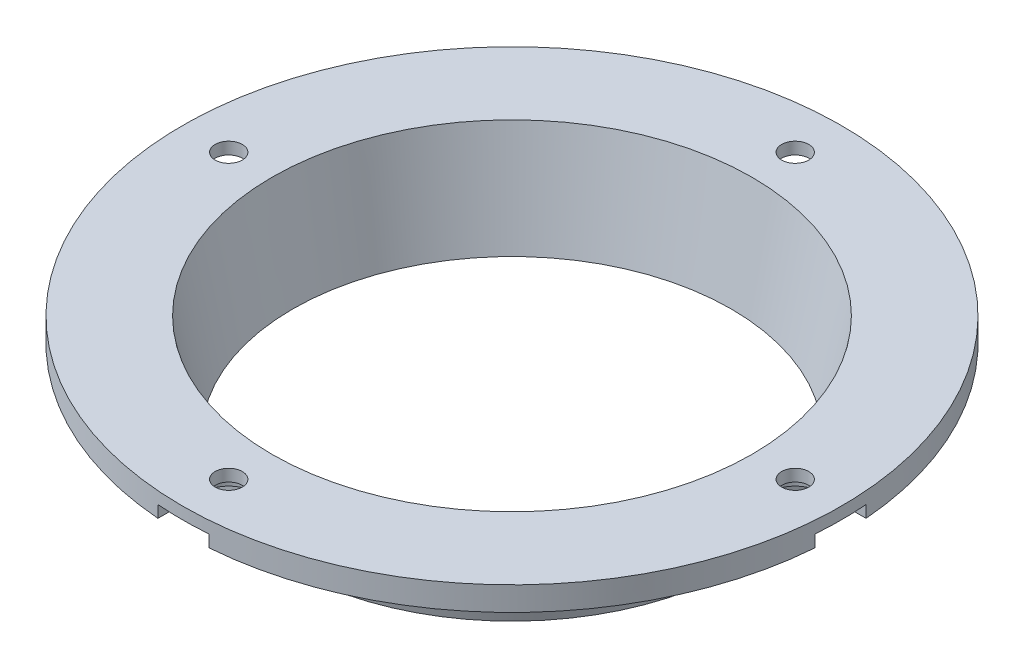
ISO-10303-21;
HEADER;
FILE_DESCRIPTION(('STEP AP214'),'2;1');
FILE_NAME('part.step','',(''),(''),'','','');
FILE_SCHEMA(('AUTOMOTIVE_DESIGN { 1 0 10303 214 1 1 1 1 }'));
ENDSEC;
DATA;
#1=APPLICATION_CONTEXT('core data for automotive mechanical design processes');
#2=APPLICATION_PROTOCOL_DEFINITION('international standard','automotive_design',2000,#1);
#3=PRODUCT_CONTEXT('',#1,'mechanical');
#4=PRODUCT('Part','Part','',(#3));
#5=PRODUCT_RELATED_PRODUCT_CATEGORY('part','',(#4));
#6=PRODUCT_DEFINITION_FORMATION('','',#4);
#7=PRODUCT_DEFINITION_CONTEXT('part definition',#1,'design');
#8=PRODUCT_DEFINITION('design','',#6,#7);
#9=PRODUCT_DEFINITION_SHAPE('','',#8);
#10=(LENGTH_UNIT() NAMED_UNIT(*) SI_UNIT(.MILLI.,.METRE.));
#11=(NAMED_UNIT(*) PLANE_ANGLE_UNIT() SI_UNIT($,.RADIAN.));
#12=(NAMED_UNIT(*) SI_UNIT($,.STERADIAN.) SOLID_ANGLE_UNIT());
#13=UNCERTAINTY_MEASURE_WITH_UNIT(LENGTH_MEASURE(1.E-05),#10,'distance_accuracy_value','');
#14=(GEOMETRIC_REPRESENTATION_CONTEXT(3) GLOBAL_UNCERTAINTY_ASSIGNED_CONTEXT((#13)) GLOBAL_UNIT_ASSIGNED_CONTEXT((#10,
#11,#12)) REPRESENTATION_CONTEXT('',''));
#15=CARTESIAN_POINT('',(0.,0.,0.));
#16=DIRECTION('',(0.,0.,1.));
#17=DIRECTION('',(1.,0.,0.));
#18=AXIS2_PLACEMENT_3D('',#15,#16,#17);
#19=CARTESIAN_POINT('',(-3.19999999999799,-8.,0.));
#20=DIRECTION('',(-1.,0.,0.));
#21=DIRECTION('',(0.,0.,1.));
#22=AXIS2_PLACEMENT_3D('',#19,#20,#21);
#23=PLANE('',#22);
#24=DIRECTION('',(0.,0.,-1.));
#25=VECTOR('',#24,1.);
#26=CARTESIAN_POINT('',(-3.19999999999799,1.5,0.));
#27=LINE('',#26,#25);
#28=CARTESIAN_POINT('',(-3.19999999999799,1.5,-35.5));
#29=VERTEX_POINT('',#28);
#30=CARTESIAN_POINT('',(-3.19999999999799,1.5,-41.1758424321836));
#31=VERTEX_POINT('',#30);
#32=EDGE_CURVE('E282',#29,#31,#27,.T.);
#33=ORIENTED_EDGE('',*,*,#32,.F.);
#34=DIRECTION('',(0.,1.,0.));
#35=VECTOR('',#34,1.);
#36=CARTESIAN_POINT('',(-3.19999999999799,-8.,-35.5));
#37=LINE('',#36,#35);
#38=CARTESIAN_POINT('',(-3.19999999999799,0.,-35.5));
#39=VERTEX_POINT('',#38);
#40=EDGE_CURVE('E174',#39,#29,#37,.T.);
#41=ORIENTED_EDGE('',*,*,#40,.F.);
#42=DIRECTION('',(0.,0.,-1.));
#43=VECTOR('',#42,1.);
#44=CARTESIAN_POINT('',(-3.19999999999799,0.,0.));
#45=LINE('',#44,#43);
#46=CARTESIAN_POINT('',(-3.19999999999799,0.,-41.1758424321836));
#47=VERTEX_POINT('',#46);
#48=EDGE_CURVE('E163',#39,#47,#45,.T.);
#49=ORIENTED_EDGE('',*,*,#48,.T.);
#50=DIRECTION('',(0.,-1.,0.));
#51=VECTOR('',#50,1.);
#52=CARTESIAN_POINT('',(-3.19999999999799,118.814040252018,-41.1758424321836));
#53=LINE('',#52,#51);
#54=EDGE_CURVE('E57',#47,#31,#53,.F.);
#55=ORIENTED_EDGE('',*,*,#54,.T.);
#56=EDGE_LOOP('',(#33,#41,#49,#55));
#57=FACE_BOUND('',#56,.T.);
#58=ADVANCED_FACE('F41',(#57),#23,.F.);
#59=CARTESIAN_POINT('',(3.200000000002,-8.,0.));
#60=DIRECTION('',(1.,0.,0.));
#61=DIRECTION('',(0.,0.,-1.));
#62=AXIS2_PLACEMENT_3D('',#59,#60,#61);
#63=PLANE('',#62);
#64=DIRECTION('',(0.,0.,1.));
#65=VECTOR('',#64,1.);
#66=CARTESIAN_POINT('',(3.200000000002,1.5,0.));
#67=LINE('',#66,#65);
#68=CARTESIAN_POINT('',(3.200000000002,1.5,-41.1758424321833));
#69=VERTEX_POINT('',#68);
#70=CARTESIAN_POINT('',(3.200000000002,1.5,-35.5));
#71=VERTEX_POINT('',#70);
#72=EDGE_CURVE('E65',#69,#71,#67,.T.);
#73=ORIENTED_EDGE('',*,*,#72,.F.);
#74=DIRECTION('',(0.,-1.,0.));
#75=VECTOR('',#74,1.);
#76=CARTESIAN_POINT('',(3.200000000002,118.814040252018,-41.1758424321833));
#77=LINE('',#76,#75);
#78=CARTESIAN_POINT('',(3.200000000002,0.,-41.1758424321833));
#79=VERTEX_POINT('',#78);
#80=EDGE_CURVE('E158',#69,#79,#77,.T.);
#81=ORIENTED_EDGE('',*,*,#80,.T.);
#82=DIRECTION('',(0.,0.,1.));
#83=VECTOR('',#82,1.);
#84=CARTESIAN_POINT('',(3.200000000002,0.,0.));
#85=LINE('',#84,#83);
#86=CARTESIAN_POINT('',(3.200000000002,0.,-35.5));
#87=VERTEX_POINT('',#86);
#88=EDGE_CURVE('E154',#79,#87,#85,.T.);
#89=ORIENTED_EDGE('',*,*,#88,.T.);
#90=DIRECTION('',(0.,1.,0.));
#91=VECTOR('',#90,1.);
#92=CARTESIAN_POINT('',(3.200000000002,-8.,-35.5));
#93=LINE('',#92,#91);
#94=EDGE_CURVE('E157',#87,#71,#93,.T.);
#95=ORIENTED_EDGE('',*,*,#94,.T.);
#96=EDGE_LOOP('',(#73,#81,#89,#95));
#97=FACE_BOUND('',#96,.T.);
#98=ADVANCED_FACE('F156',(#97),#63,.F.);
#99=CARTESIAN_POINT('',(2.0122792321331E-12,-8.,-35.5));
#100=DIRECTION('',(0.,1.,0.));
#101=DIRECTION('',(0.,0.,1.));
#102=AXIS2_PLACEMENT_3D('',#99,#100,#101);
#103=CYLINDRICAL_SURFACE('',#102,3.2);
#104=CARTESIAN_POINT('',(2.0122792321331E-12,1.5,-35.5));
#105=DIRECTION('',(0.,1.,0.));
#106=DIRECTION('',(0.,0.,1.));
#107=AXIS2_PLACEMENT_3D('',#104,#105,#106);
#108=CIRCLE('',#107,3.2);
#109=EDGE_CURVE('E172',#71,#29,#108,.F.);
#110=ORIENTED_EDGE('',*,*,#109,.F.);
#111=ORIENTED_EDGE('',*,*,#94,.F.);
#112=CARTESIAN_POINT('',(2.0122792321331E-12,0.,-35.5));
#113=DIRECTION('',(0.,-1.,0.));
#114=DIRECTION('',(0.,0.,-1.));
#115=AXIS2_PLACEMENT_3D('',#112,#113,#114);
#116=CIRCLE('',#115,3.2);
#117=EDGE_CURVE('E169',#87,#39,#116,.T.);
#118=ORIENTED_EDGE('',*,*,#117,.T.);
#119=ORIENTED_EDGE('',*,*,#40,.T.);
#120=EDGE_LOOP('',(#110,#111,#118,#119));
#121=FACE_BOUND('',#120,.T.);
#122=ADVANCED_FACE('F167',(#121),#103,.F.);
#123=CARTESIAN_POINT('',(0.,-8.,3.19999999999799));
#124=DIRECTION('',(0.,0.,1.));
#125=DIRECTION('',(1.,0.,0.));
#126=AXIS2_PLACEMENT_3D('',#123,#124,#125);
#127=PLANE('',#126);
#128=DIRECTION('',(-1.,0.,0.));
#129=VECTOR('',#128,1.);
#130=CARTESIAN_POINT('',(0.,1.5,3.19999999999799));
#131=LINE('',#130,#129);
#132=CARTESIAN_POINT('',(-35.5,1.5,3.19999999999762));
#133=VERTEX_POINT('',#132);
#134=CARTESIAN_POINT('',(-41.1758424321837,1.5,3.19999999999756));
#135=VERTEX_POINT('',#134);
#136=EDGE_CURVE('E268',#133,#135,#131,.T.);
#137=ORIENTED_EDGE('',*,*,#136,.F.);
#138=DIRECTION('',(0.,1.,0.));
#139=VECTOR('',#138,1.);
#140=CARTESIAN_POINT('',(-35.5,-8.,3.19999999999762));
#141=LINE('',#140,#139);
#142=CARTESIAN_POINT('',(-35.5,0.,3.19999999999762));
#143=VERTEX_POINT('',#142);
#144=EDGE_CURVE('E173',#143,#133,#141,.T.);
#145=ORIENTED_EDGE('',*,*,#144,.F.);
#146=DIRECTION('',(-1.,0.,0.));
#147=VECTOR('',#146,1.);
#148=CARTESIAN_POINT('',(0.,0.,3.19999999999799));
#149=LINE('',#148,#147);
#150=CARTESIAN_POINT('',(-41.1758424321837,0.,3.19999999999756));
#151=VERTEX_POINT('',#150);
#152=EDGE_CURVE('E254',#143,#151,#149,.T.);
#153=ORIENTED_EDGE('',*,*,#152,.T.);
#154=DIRECTION('',(0.,-1.,0.));
#155=VECTOR('',#154,1.);
#156=CARTESIAN_POINT('',(-41.1758424321837,118.814040252018,3.19999999999756));
#157=LINE('',#156,#155);
#158=EDGE_CURVE('E228',#151,#135,#157,.F.);
#159=ORIENTED_EDGE('',*,*,#158,.T.);
#160=EDGE_LOOP('',(#137,#145,#153,#159));
#161=FACE_BOUND('',#160,.T.);
#162=ADVANCED_FACE('F266',(#161),#127,.F.);
#163=CARTESIAN_POINT('',(0.,-8.,-3.200000000002));
#164=DIRECTION('',(0.,0.,-1.));
#165=DIRECTION('',(-1.,0.,0.));
#166=AXIS2_PLACEMENT_3D('',#163,#164,#165);
#167=PLANE('',#166);
#168=DIRECTION('',(1.,0.,0.));
#169=VECTOR('',#168,1.);
#170=CARTESIAN_POINT('',(0.,1.5,-3.200000000002));
#171=LINE('',#170,#169);
#172=CARTESIAN_POINT('',(-41.1758424321833,1.5,-3.20000000000243));
#173=VERTEX_POINT('',#172);
#174=CARTESIAN_POINT('',(-35.5,1.5,-3.20000000000237));
#175=VERTEX_POINT('',#174);
#176=EDGE_CURVE('E275',#173,#175,#171,.T.);
#177=ORIENTED_EDGE('',*,*,#176,.F.);
#178=DIRECTION('',(0.,-1.,0.));
#179=VECTOR('',#178,1.);
#180=CARTESIAN_POINT('',(-41.1758424321833,118.814040252018,-3.20000000000243));
#181=LINE('',#180,#179);
#182=CARTESIAN_POINT('',(-41.1758424321833,0.,-3.20000000000243));
#183=VERTEX_POINT('',#182);
#184=EDGE_CURVE('E226',#173,#183,#181,.T.);
#185=ORIENTED_EDGE('',*,*,#184,.T.);
#186=DIRECTION('',(1.,0.,0.));
#187=VECTOR('',#186,1.);
#188=CARTESIAN_POINT('',(0.,0.,-3.200000000002));
#189=LINE('',#188,#187);
#190=CARTESIAN_POINT('',(-35.5,0.,-3.20000000000237));
#191=VERTEX_POINT('',#190);
#192=EDGE_CURVE('E296',#183,#191,#189,.T.);
#193=ORIENTED_EDGE('',*,*,#192,.T.);
#194=DIRECTION('',(0.,1.,0.));
#195=VECTOR('',#194,1.);
#196=CARTESIAN_POINT('',(-35.5,-8.,-3.20000000000237));
#197=LINE('',#196,#195);
#198=EDGE_CURVE('E290',#191,#175,#197,.T.);
#199=ORIENTED_EDGE('',*,*,#198,.T.);
#200=EDGE_LOOP('',(#177,#185,#193,#199));
#201=FACE_BOUND('',#200,.T.);
#202=ADVANCED_FACE('F414',(#201),#167,.F.);
#203=CARTESIAN_POINT('',(-35.5,-8.,-2.38412199471989E-12));
#204=DIRECTION('',(0.,1.,0.));
#205=DIRECTION('',(0.,0.,1.));
#206=AXIS2_PLACEMENT_3D('',#203,#204,#205);
#207=CYLINDRICAL_SURFACE('',#206,3.2);
#208=CARTESIAN_POINT('',(-35.5,1.5,-2.38412199471989E-12));
#209=DIRECTION('',(0.,1.,0.));
#210=DIRECTION('',(0.,0.,1.));
#211=AXIS2_PLACEMENT_3D('',#208,#209,#210);
#212=CIRCLE('',#211,3.2);
#213=EDGE_CURVE('E274',#175,#133,#212,.F.);
#214=ORIENTED_EDGE('',*,*,#213,.F.);
#215=ORIENTED_EDGE('',*,*,#198,.F.);
#216=CARTESIAN_POINT('',(-35.5,0.,-2.38412199471989E-12));
#217=DIRECTION('',(0.,-1.,0.));
#218=DIRECTION('',(0.,0.,-1.));
#219=AXIS2_PLACEMENT_3D('',#216,#217,#218);
#220=CIRCLE('',#219,3.2);
#221=EDGE_CURVE('E180',#191,#143,#220,.T.);
#222=ORIENTED_EDGE('',*,*,#221,.T.);
#223=ORIENTED_EDGE('',*,*,#144,.T.);
#224=EDGE_LOOP('',(#214,#215,#222,#223));
#225=FACE_BOUND('',#224,.T.);
#226=ADVANCED_FACE('F413',(#225),#207,.F.);
#227=CARTESIAN_POINT('',(3.19999999999799,-8.,0.));
#228=DIRECTION('',(1.,0.,0.));
#229=DIRECTION('',(0.,0.,-1.));
#230=AXIS2_PLACEMENT_3D('',#227,#228,#229);
#231=PLANE('',#230);
#232=DIRECTION('',(0.,0.,1.));
#233=VECTOR('',#232,1.);
#234=CARTESIAN_POINT('',(3.19999999999799,1.5,0.));
#235=LINE('',#234,#233);
#236=CARTESIAN_POINT('',(3.19999999999774,1.5,35.5));
#237=VERTEX_POINT('',#236);
#238=CARTESIAN_POINT('',(3.1999999999977,1.5,41.1758424321836));
#239=VERTEX_POINT('',#238);
#240=EDGE_CURVE('E315',#237,#239,#235,.T.);
#241=ORIENTED_EDGE('',*,*,#240,.F.);
#242=DIRECTION('',(0.,1.,0.));
#243=VECTOR('',#242,1.);
#244=CARTESIAN_POINT('',(3.19999999999774,-8.,35.5));
#245=LINE('',#244,#243);
#246=CARTESIAN_POINT('',(3.19999999999774,0.,35.5));
#247=VERTEX_POINT('',#246);
#248=EDGE_CURVE('E287',#247,#237,#245,.T.);
#249=ORIENTED_EDGE('',*,*,#248,.F.);
#250=DIRECTION('',(0.,0.,1.));
#251=VECTOR('',#250,1.);
#252=CARTESIAN_POINT('',(3.19999999999799,0.,0.));
#253=LINE('',#252,#251);
#254=CARTESIAN_POINT('',(3.1999999999977,0.,41.1758424321836));
#255=VERTEX_POINT('',#254);
#256=EDGE_CURVE('E213',#247,#255,#253,.T.);
#257=ORIENTED_EDGE('',*,*,#256,.T.);
#258=DIRECTION('',(0.,-1.,0.));
#259=VECTOR('',#258,1.);
#260=CARTESIAN_POINT('',(3.1999999999977,118.814040252018,41.1758424321836));
#261=LINE('',#260,#259);
#262=EDGE_CURVE('E232',#255,#239,#261,.F.);
#263=ORIENTED_EDGE('',*,*,#262,.T.);
#264=EDGE_LOOP('',(#241,#249,#257,#263));
#265=FACE_BOUND('',#264,.T.);
#266=ADVANCED_FACE('F301',(#265),#231,.F.);
#267=CARTESIAN_POINT('',(-3.200000000002,-8.,0.));
#268=DIRECTION('',(-1.,0.,0.));
#269=DIRECTION('',(0.,0.,1.));
#270=AXIS2_PLACEMENT_3D('',#267,#268,#269);
#271=PLANE('',#270);
#272=DIRECTION('',(0.,0.,-1.));
#273=VECTOR('',#272,1.);
#274=CARTESIAN_POINT('',(-3.200000000002,1.5,0.));
#275=LINE('',#274,#273);
#276=CARTESIAN_POINT('',(-3.20000000000229,1.5,41.1758424321833));
#277=VERTEX_POINT('',#276);
#278=CARTESIAN_POINT('',(-3.20000000000225,1.5,35.5));
#279=VERTEX_POINT('',#278);
#280=EDGE_CURVE('E311',#277,#279,#275,.T.);
#281=ORIENTED_EDGE('',*,*,#280,.F.);
#282=DIRECTION('',(0.,-1.,0.));
#283=VECTOR('',#282,1.);
#284=CARTESIAN_POINT('',(-3.20000000000229,118.814040252018,41.1758424321833));
#285=LINE('',#284,#283);
#286=CARTESIAN_POINT('',(-3.20000000000229,0.,41.1758424321833));
#287=VERTEX_POINT('',#286);
#288=EDGE_CURVE('E230',#277,#287,#285,.T.);
#289=ORIENTED_EDGE('',*,*,#288,.T.);
#290=DIRECTION('',(0.,0.,-1.));
#291=VECTOR('',#290,1.);
#292=CARTESIAN_POINT('',(-3.200000000002,0.,0.));
#293=LINE('',#292,#291);
#294=CARTESIAN_POINT('',(-3.20000000000225,0.,35.5));
#295=VERTEX_POINT('',#294);
#296=EDGE_CURVE('E256',#287,#295,#293,.T.);
#297=ORIENTED_EDGE('',*,*,#296,.T.);
#298=DIRECTION('',(0.,1.,0.));
#299=VECTOR('',#298,1.);
#300=CARTESIAN_POINT('',(-3.20000000000225,-8.,35.5));
#301=LINE('',#300,#299);
#302=EDGE_CURVE('E205',#295,#279,#301,.T.);
#303=ORIENTED_EDGE('',*,*,#302,.T.);
#304=EDGE_LOOP('',(#281,#289,#297,#303));
#305=FACE_BOUND('',#304,.T.);
#306=ADVANCED_FACE('F310',(#305),#271,.F.);
#307=CARTESIAN_POINT('',(-2.26017440719096E-12,-8.,35.5));
#308=DIRECTION('',(0.,1.,0.));
#309=DIRECTION('',(0.,0.,1.));
#310=AXIS2_PLACEMENT_3D('',#307,#308,#309);
#311=CYLINDRICAL_SURFACE('',#310,3.2);
#312=CARTESIAN_POINT('',(-2.26017440719096E-12,1.5,35.5));
#313=DIRECTION('',(0.,1.,0.));
#314=DIRECTION('',(0.,0.,1.));
#315=AXIS2_PLACEMENT_3D('',#312,#313,#314);
#316=CIRCLE('',#315,3.2);
#317=EDGE_CURVE('E307',#279,#237,#316,.F.);
#318=ORIENTED_EDGE('',*,*,#317,.F.);
#319=ORIENTED_EDGE('',*,*,#302,.F.);
#320=CARTESIAN_POINT('',(-2.26017440719096E-12,0.,35.5));
#321=DIRECTION('',(0.,-1.,0.));
#322=DIRECTION('',(0.,0.,-1.));
#323=AXIS2_PLACEMENT_3D('',#320,#321,#322);
#324=CIRCLE('',#323,3.2);
#325=EDGE_CURVE('E183',#295,#247,#324,.T.);
#326=ORIENTED_EDGE('',*,*,#325,.T.);
#327=ORIENTED_EDGE('',*,*,#248,.T.);
#328=EDGE_LOOP('',(#318,#319,#326,#327));
#329=FACE_BOUND('',#328,.T.);
#330=ADVANCED_FACE('F305',(#329),#311,.F.);
#331=CARTESIAN_POINT('',(0.,-8.,-3.19999999999799));
#332=DIRECTION('',(0.,0.,-1.));
#333=DIRECTION('',(-1.,0.,0.));
#334=AXIS2_PLACEMENT_3D('',#331,#332,#333);
#335=PLANE('',#334);
#336=DIRECTION('',(1.,0.,0.));
#337=VECTOR('',#336,1.);
#338=CARTESIAN_POINT('',(0.,1.5,-3.19999999999799));
#339=LINE('',#338,#337);
#340=CARTESIAN_POINT('',(35.5,1.5,-3.19999999999787));
#341=VERTEX_POINT('',#340);
#342=CARTESIAN_POINT('',(41.1758424321836,1.5,-3.19999999999785));
#343=VERTEX_POINT('',#342);
#344=EDGE_CURVE('E204',#341,#343,#339,.T.);
#345=ORIENTED_EDGE('',*,*,#344,.F.);
#346=DIRECTION('',(0.,1.,0.));
#347=VECTOR('',#346,1.);
#348=CARTESIAN_POINT('',(35.5,-8.,-3.19999999999787));
#349=LINE('',#348,#347);
#350=CARTESIAN_POINT('',(35.5,0.,-3.19999999999787));
#351=VERTEX_POINT('',#350);
#352=EDGE_CURVE('E196',#351,#341,#349,.T.);
#353=ORIENTED_EDGE('',*,*,#352,.F.);
#354=DIRECTION('',(1.,0.,0.));
#355=VECTOR('',#354,1.);
#356=CARTESIAN_POINT('',(0.,0.,-3.19999999999799));
#357=LINE('',#356,#355);
#358=CARTESIAN_POINT('',(41.1758424321836,0.,-3.19999999999785));
#359=VERTEX_POINT('',#358);
#360=EDGE_CURVE('E201',#351,#359,#357,.T.);
#361=ORIENTED_EDGE('',*,*,#360,.T.);
#362=DIRECTION('',(0.,-1.,0.));
#363=VECTOR('',#362,1.);
#364=CARTESIAN_POINT('',(41.1758424321836,118.814040252018,-3.19999999999785));
#365=LINE('',#364,#363);
#366=EDGE_CURVE('E181',#359,#343,#365,.F.);
#367=ORIENTED_EDGE('',*,*,#366,.T.);
#368=EDGE_LOOP('',(#345,#353,#361,#367));
#369=FACE_BOUND('',#368,.T.);
#370=ADVANCED_FACE('F200',(#369),#335,.F.);
#371=CARTESIAN_POINT('',(0.,-8.,3.200000000002));
#372=DIRECTION('',(0.,0.,1.));
#373=DIRECTION('',(1.,0.,0.));
#374=AXIS2_PLACEMENT_3D('',#371,#372,#373);
#375=PLANE('',#374);
#376=DIRECTION('',(-1.,0.,0.));
#377=VECTOR('',#376,1.);
#378=CARTESIAN_POINT('',(0.,1.5,3.200000000002));
#379=LINE('',#378,#377);
#380=CARTESIAN_POINT('',(41.1758424321833,1.5,3.20000000000215));
#381=VERTEX_POINT('',#380);
#382=CARTESIAN_POINT('',(35.5,1.5,3.20000000000213));
#383=VERTEX_POINT('',#382);
#384=EDGE_CURVE('E237',#381,#383,#379,.T.);
#385=ORIENTED_EDGE('',*,*,#384,.F.);
#386=DIRECTION('',(0.,-1.,0.));
#387=VECTOR('',#386,1.);
#388=CARTESIAN_POINT('',(41.1758424321833,118.814040252018,3.20000000000215));
#389=LINE('',#388,#387);
#390=CARTESIAN_POINT('',(41.1758424321833,0.,3.20000000000215));
#391=VERTEX_POINT('',#390);
#392=EDGE_CURVE('E185',#381,#391,#389,.T.);
#393=ORIENTED_EDGE('',*,*,#392,.T.);
#394=DIRECTION('',(-1.,0.,0.));
#395=VECTOR('',#394,1.);
#396=CARTESIAN_POINT('',(0.,0.,3.200000000002));
#397=LINE('',#396,#395);
#398=CARTESIAN_POINT('',(35.5,0.,3.20000000000213));
#399=VERTEX_POINT('',#398);
#400=EDGE_CURVE('E209',#391,#399,#397,.T.);
#401=ORIENTED_EDGE('',*,*,#400,.T.);
#402=DIRECTION('',(0.,1.,0.));
#403=VECTOR('',#402,1.);
#404=CARTESIAN_POINT('',(35.5,-8.,3.20000000000213));
#405=LINE('',#404,#403);
#406=EDGE_CURVE('E164',#399,#383,#405,.T.);
#407=ORIENTED_EDGE('',*,*,#406,.T.);
#408=EDGE_LOOP('',(#385,#393,#401,#407));
#409=FACE_BOUND('',#408,.T.);
#410=ADVANCED_FACE('F235',(#409),#375,.F.);
#411=CARTESIAN_POINT('',(35.5,-8.,2.13622681966203E-12));
#412=DIRECTION('',(0.,1.,0.));
#413=DIRECTION('',(0.,0.,1.));
#414=AXIS2_PLACEMENT_3D('',#411,#412,#413);
#415=CYLINDRICAL_SURFACE('',#414,3.2);
#416=CARTESIAN_POINT('',(35.5,1.5,2.13622681966203E-12));
#417=DIRECTION('',(0.,1.,0.));
#418=DIRECTION('',(0.,0.,1.));
#419=AXIS2_PLACEMENT_3D('',#416,#417,#418);
#420=CIRCLE('',#419,3.2);
#421=EDGE_CURVE('E11',#383,#341,#420,.F.);
#422=ORIENTED_EDGE('',*,*,#421,.F.);
#423=ORIENTED_EDGE('',*,*,#406,.F.);
#424=CARTESIAN_POINT('',(35.5,0.,2.13622681966203E-12));
#425=DIRECTION('',(0.,-1.,0.));
#426=DIRECTION('',(0.,0.,-1.));
#427=AXIS2_PLACEMENT_3D('',#424,#425,#426);
#428=CIRCLE('',#427,3.2);
#429=EDGE_CURVE('E50',#399,#351,#428,.T.);
#430=ORIENTED_EDGE('',*,*,#429,.T.);
#431=ORIENTED_EDGE('',*,*,#352,.T.);
#432=EDGE_LOOP('',(#422,#423,#430,#431));
#433=FACE_BOUND('',#432,.T.);
#434=ADVANCED_FACE('F195',(#433),#415,.F.);
#435=CARTESIAN_POINT('',(0.,0.,0.));
#436=DIRECTION('',(0.,-1.,0.));
#437=DIRECTION('',(0.,0.,-1.));
#438=AXIS2_PLACEMENT_3D('',#435,#436,#437);
#439=PLANE('',#438);
#440=ORIENTED_EDGE('',*,*,#360,.F.);
#441=ORIENTED_EDGE('',*,*,#429,.F.);
#442=ORIENTED_EDGE('',*,*,#400,.F.);
#443=CARTESIAN_POINT('',(0.,0.,0.));
#444=DIRECTION('',(0.,-1.,0.));
#445=DIRECTION('',(0.,0.,-1.));
#446=AXIS2_PLACEMENT_3D('',#443,#444,#445);
#447=CIRCLE('',#446,41.3);
#448=EDGE_CURVE('E218',#391,#255,#447,.T.);
#449=ORIENTED_EDGE('',*,*,#448,.T.);
#450=ORIENTED_EDGE('',*,*,#256,.F.);
#451=ORIENTED_EDGE('',*,*,#325,.F.);
#452=ORIENTED_EDGE('',*,*,#296,.F.);
#453=EDGE_CURVE('E211',#287,#151,#447,.T.);
#454=ORIENTED_EDGE('',*,*,#453,.T.);
#455=ORIENTED_EDGE('',*,*,#152,.F.);
#456=ORIENTED_EDGE('',*,*,#221,.F.);
#457=ORIENTED_EDGE('',*,*,#192,.F.);
#458=EDGE_CURVE('E208',#183,#47,#447,.T.);
#459=ORIENTED_EDGE('',*,*,#458,.T.);
#460=ORIENTED_EDGE('',*,*,#48,.F.);
#461=ORIENTED_EDGE('',*,*,#117,.F.);
#462=ORIENTED_EDGE('',*,*,#88,.F.);
#463=EDGE_CURVE('E207',#79,#359,#447,.T.);
#464=ORIENTED_EDGE('',*,*,#463,.T.);
#465=EDGE_LOOP('',(#440,#441,#442,#449,#450,#451,#452,#454,#455,#456,#457,#459,#460,#461,#462,#464));
#466=FACE_BOUND('',#465,.T.);
#467=CARTESIAN_POINT('',(0.,0.,0.));
#468=DIRECTION('',(0.,1.,0.));
#469=DIRECTION('',(0.,0.,1.));
#470=AXIS2_PLACEMENT_3D('',#467,#468,#469);
#471=CIRCLE('',#470,30.5);
#472=CARTESIAN_POINT('',(0.,0.,30.5));
#473=VERTEX_POINT('',#472);
#474=EDGE_CURVE('E221',#473,#473,#471,.T.);
#475=ORIENTED_EDGE('',*,*,#474,.T.);
#476=EDGE_LOOP('',(#475));
#477=FACE_BOUND('',#476,.T.);
#478=ADVANCED_FACE('F43',(#466,#477),#439,.T.);
#479=CARTESIAN_POINT('',(0.,-9.99999999999999,0.));
#480=DIRECTION('',(0.,1.,0.));
#481=DIRECTION('',(0.,0.,1.));
#482=AXIS2_PLACEMENT_3D('',#479,#480,#481);
#483=CONICAL_SURFACE('',#482,28.5,0.197395559849884);
#484=ORIENTED_EDGE('',*,*,#474,.F.);
#485=EDGE_LOOP('',(#484));
#486=FACE_BOUND('',#485,.T.);
#487=CARTESIAN_POINT('',(0.,-9.99999999999999,0.));
#488=DIRECTION('',(0.,1.,0.));
#489=DIRECTION('',(0.,0.,1.));
#490=AXIS2_PLACEMENT_3D('',#487,#488,#489);
#491=CIRCLE('',#490,28.5);
#492=CARTESIAN_POINT('',(0.,-9.99999999999999,28.5));
#493=VERTEX_POINT('',#492);
#494=EDGE_CURVE('E217',#493,#493,#491,.T.);
#495=ORIENTED_EDGE('',*,*,#494,.T.);
#496=EDGE_LOOP('',(#495));
#497=FACE_BOUND('',#496,.T.);
#498=ADVANCED_FACE('F385',(#486,#497),#483,.T.);
#499=CARTESIAN_POINT('',(0.,-9.99999999999999,0.));
#500=DIRECTION('',(0.,-1.,0.));
#501=DIRECTION('',(0.,0.,-1.));
#502=AXIS2_PLACEMENT_3D('',#499,#500,#501);
#503=PLANE('',#502);
#504=CARTESIAN_POINT('',(0.,-10.,0.));
#505=DIRECTION('',(0.,1.,0.));
#506=DIRECTION('',(-1.,0.,0.));
#507=AXIS2_PLACEMENT_3D('',#504,#505,#506);
#508=CIRCLE('',#507,27.4801960972814);
#509=CARTESIAN_POINT('',(-27.4801960972814,-9.99999999999999,0.));
#510=VERTEX_POINT('',#509);
#511=EDGE_CURVE('E351',#510,#510,#508,.T.);
#512=ORIENTED_EDGE('',*,*,#511,.T.);
#513=EDGE_LOOP('',(#512));
#514=FACE_BOUND('',#513,.T.);
#515=ORIENTED_EDGE('',*,*,#494,.F.);
#516=EDGE_LOOP('',(#515));
#517=FACE_BOUND('',#516,.T.);
#518=ADVANCED_FACE('F383',(#514,#517),#503,.T.);
#519=CARTESIAN_POINT('',(0.,118.814040252018,0.));
#520=DIRECTION('',(0.,-1.,0.));
#521=DIRECTION('',(0.,0.,-1.));
#522=AXIS2_PLACEMENT_3D('',#519,#520,#521);
#523=CYLINDRICAL_SURFACE('',#522,41.3);
#524=CARTESIAN_POINT('',(0.,1.5,0.));
#525=DIRECTION('',(0.,1.,0.));
#526=DIRECTION('',(0.,0.,1.));
#527=AXIS2_PLACEMENT_3D('',#524,#525,#526);
#528=CIRCLE('',#527,41.3);
#529=EDGE_CURVE('E724',#69,#31,#528,.T.);
#530=ORIENTED_EDGE('',*,*,#529,.T.);
#531=ORIENTED_EDGE('',*,*,#54,.F.);
#532=ORIENTED_EDGE('',*,*,#458,.F.);
#533=ORIENTED_EDGE('',*,*,#184,.F.);
#534=EDGE_CURVE('E263',#173,#135,#528,.T.);
#535=ORIENTED_EDGE('',*,*,#534,.T.);
#536=ORIENTED_EDGE('',*,*,#158,.F.);
#537=ORIENTED_EDGE('',*,*,#453,.F.);
#538=ORIENTED_EDGE('',*,*,#288,.F.);
#539=EDGE_CURVE('E314',#277,#239,#528,.T.);
#540=ORIENTED_EDGE('',*,*,#539,.T.);
#541=ORIENTED_EDGE('',*,*,#262,.F.);
#542=ORIENTED_EDGE('',*,*,#448,.F.);
#543=ORIENTED_EDGE('',*,*,#392,.F.);
#544=EDGE_CURVE('E322',#381,#343,#528,.T.);
#545=ORIENTED_EDGE('',*,*,#544,.T.);
#546=ORIENTED_EDGE('',*,*,#366,.F.);
#547=ORIENTED_EDGE('',*,*,#463,.F.);
#548=ORIENTED_EDGE('',*,*,#80,.F.);
#549=EDGE_LOOP('',(#530,#531,#532,#533,#535,#536,#537,#538,#540,#541,#542,#543,#545,#546,#547,#548));
#550=FACE_BOUND('',#549,.T.);
#551=CARTESIAN_POINT('',(0.,3.,0.));
#552=DIRECTION('',(0.,1.,0.));
#553=DIRECTION('',(0.,0.,1.));
#554=AXIS2_PLACEMENT_3D('',#551,#552,#553);
#555=CIRCLE('',#554,41.3);
#556=CARTESIAN_POINT('',(0.,3.,41.3));
#557=VERTEX_POINT('',#556);
#558=EDGE_CURVE('E324',#557,#557,#555,.T.);
#559=ORIENTED_EDGE('',*,*,#558,.F.);
#560=EDGE_LOOP('',(#559));
#561=FACE_BOUND('',#560,.T.);
#562=ADVANCED_FACE('F246',(#550,#561),#523,.T.);
#563=CARTESIAN_POINT('',(0.,1.5,0.));
#564=DIRECTION('',(0.,1.,0.));
#565=DIRECTION('',(0.,0.,1.));
#566=AXIS2_PLACEMENT_3D('',#563,#564,#565);
#567=PLANE('',#566);
#568=CARTESIAN_POINT('',(35.500000000001,1.5,-1.00267016911459E-12));
#569=DIRECTION('',(0.,1.,0.));
#570=DIRECTION('',(0.,0.,1.));
#571=AXIS2_PLACEMENT_3D('',#568,#569,#570);
#572=CIRCLE('',#571,1.7);
#573=CARTESIAN_POINT('',(35.500000000001,1.5,1.699999999999));
#574=VERTEX_POINT('',#573);
#575=EDGE_CURVE('E330',#574,#574,#572,.T.);
#576=ORIENTED_EDGE('',*,*,#575,.T.);
#577=EDGE_LOOP('',(#576));
#578=FACE_BOUND('',#577,.T.);
#579=ORIENTED_EDGE('',*,*,#421,.T.);
#580=ORIENTED_EDGE('',*,*,#344,.T.);
#581=ORIENTED_EDGE('',*,*,#544,.F.);
#582=ORIENTED_EDGE('',*,*,#384,.T.);
#583=EDGE_LOOP('',(#579,#580,#581,#582));
#584=FACE_BOUND('',#583,.T.);
#585=ADVANCED_FACE('F382',(#578,#584),#567,.F.);
#586=CARTESIAN_POINT('',(2.0122792321331E-12,1.5,35.5));
#587=DIRECTION('',(0.,1.,0.));
#588=DIRECTION('',(0.,0.,1.));
#589=AXIS2_PLACEMENT_3D('',#586,#587,#588);
#590=CIRCLE('',#589,1.7);
#591=CARTESIAN_POINT('',(2.0122792321331E-12,1.5,37.2));
#592=VERTEX_POINT('',#591);
#593=EDGE_CURVE('E327',#592,#592,#590,.T.);
#594=ORIENTED_EDGE('',*,*,#593,.T.);
#595=EDGE_LOOP('',(#594));
#596=FACE_BOUND('',#595,.T.);
#597=ORIENTED_EDGE('',*,*,#317,.T.);
#598=ORIENTED_EDGE('',*,*,#240,.T.);
#599=ORIENTED_EDGE('',*,*,#539,.F.);
#600=ORIENTED_EDGE('',*,*,#280,.T.);
#601=EDGE_LOOP('',(#597,#598,#599,#600));
#602=FACE_BOUND('',#601,.T.);
#603=ADVANCED_FACE('F313',(#596,#602),#567,.F.);
#604=CARTESIAN_POINT('',(-35.499999999999,1.5,1.00613961606655E-12));
#605=DIRECTION('',(0.,1.,0.));
#606=DIRECTION('',(0.,0.,1.));
#607=AXIS2_PLACEMENT_3D('',#604,#605,#606);
#608=CIRCLE('',#607,1.7);
#609=CARTESIAN_POINT('',(-35.499999999999,1.5,1.70000000000101));
#610=VERTEX_POINT('',#609);
#611=EDGE_CURVE('E333',#610,#610,#608,.T.);
#612=ORIENTED_EDGE('',*,*,#611,.T.);
#613=EDGE_LOOP('',(#612));
#614=FACE_BOUND('',#613,.T.);
#615=ORIENTED_EDGE('',*,*,#213,.T.);
#616=ORIENTED_EDGE('',*,*,#136,.T.);
#617=ORIENTED_EDGE('',*,*,#534,.F.);
#618=ORIENTED_EDGE('',*,*,#176,.T.);
#619=EDGE_LOOP('',(#615,#616,#617,#618));
#620=FACE_BOUND('',#619,.T.);
#621=ADVANCED_FACE('F272',(#614,#620),#567,.F.);
#622=CARTESIAN_POINT('',(0.,1.5,-35.5));
#623=DIRECTION('',(0.,1.,0.));
#624=DIRECTION('',(0.,0.,1.));
#625=AXIS2_PLACEMENT_3D('',#622,#623,#624);
#626=CIRCLE('',#625,1.7);
#627=CARTESIAN_POINT('',(0.,1.5,-33.8));
#628=VERTEX_POINT('',#627);
#629=EDGE_CURVE('E336',#628,#628,#626,.T.);
#630=ORIENTED_EDGE('',*,*,#629,.T.);
#631=EDGE_LOOP('',(#630));
#632=FACE_BOUND('',#631,.T.);
#633=ORIENTED_EDGE('',*,*,#109,.T.);
#634=ORIENTED_EDGE('',*,*,#32,.T.);
#635=ORIENTED_EDGE('',*,*,#529,.F.);
#636=ORIENTED_EDGE('',*,*,#72,.T.);
#637=EDGE_LOOP('',(#633,#634,#635,#636));
#638=FACE_BOUND('',#637,.T.);
#639=ADVANCED_FACE('F573',(#632,#638),#567,.F.);
#640=CARTESIAN_POINT('',(0.,3.,0.));
#641=DIRECTION('',(0.,1.,0.));
#642=DIRECTION('',(0.,0.,1.));
#643=AXIS2_PLACEMENT_3D('',#640,#641,#642);
#644=PLANE('',#643);
#645=CARTESIAN_POINT('',(0.,3.,0.));
#646=DIRECTION('',(0.,1.,0.));
#647=DIRECTION('',(0.,0.,1.));
#648=AXIS2_PLACEMENT_3D('',#645,#646,#647);
#649=CIRCLE('',#648,30.0802120312904);
#650=CARTESIAN_POINT('',(0.,3.,30.0802120312904));
#651=VERTEX_POINT('',#650);
#652=EDGE_CURVE('E45',#651,#651,#649,.F.);
#653=ORIENTED_EDGE('',*,*,#652,.T.);
#654=EDGE_LOOP('',(#653));
#655=FACE_BOUND('',#654,.T.);
#656=CARTESIAN_POINT('',(2.0122792321331E-12,3.,35.5));
#657=DIRECTION('',(0.,-1.,0.));
#658=DIRECTION('',(0.,0.,-1.));
#659=AXIS2_PLACEMENT_3D('',#656,#657,#658);
#660=CIRCLE('',#659,1.7);
#661=CARTESIAN_POINT('',(2.0122792321331E-12,3.,33.8));
#662=VERTEX_POINT('',#661);
#663=EDGE_CURVE('E339',#662,#662,#660,.T.);
#664=ORIENTED_EDGE('',*,*,#663,.T.);
#665=EDGE_LOOP('',(#664));
#666=FACE_BOUND('',#665,.T.);
#667=CARTESIAN_POINT('',(35.500000000001,3.,-1.00267016911459E-12));
#668=DIRECTION('',(0.,-1.,0.));
#669=DIRECTION('',(0.,0.,-1.));
#670=AXIS2_PLACEMENT_3D('',#667,#668,#669);
#671=CIRCLE('',#670,1.7);
#672=CARTESIAN_POINT('',(35.500000000001,3.,-1.700000000001));
#673=VERTEX_POINT('',#672);
#674=EDGE_CURVE('E346',#673,#673,#671,.T.);
#675=ORIENTED_EDGE('',*,*,#674,.T.);
#676=EDGE_LOOP('',(#675));
#677=FACE_BOUND('',#676,.T.);
#678=CARTESIAN_POINT('',(-35.499999999999,3.,1.00613961606655E-12));
#679=DIRECTION('',(0.,-1.,0.));
#680=DIRECTION('',(0.,0.,-1.));
#681=AXIS2_PLACEMENT_3D('',#678,#679,#680);
#682=CIRCLE('',#681,1.7);
#683=CARTESIAN_POINT('',(-35.499999999999,3.,-1.69999999999899));
#684=VERTEX_POINT('',#683);
#685=EDGE_CURVE('E343',#684,#684,#682,.T.);
#686=ORIENTED_EDGE('',*,*,#685,.T.);
#687=EDGE_LOOP('',(#686));
#688=FACE_BOUND('',#687,.T.);
#689=CARTESIAN_POINT('',(0.,3.,-35.5));
#690=DIRECTION('',(0.,-1.,0.));
#691=DIRECTION('',(0.,0.,-1.));
#692=AXIS2_PLACEMENT_3D('',#689,#690,#691);
#693=CIRCLE('',#692,1.7);
#694=CARTESIAN_POINT('',(0.,3.,-37.2));
#695=VERTEX_POINT('',#694);
#696=EDGE_CURVE('E340',#695,#695,#693,.T.);
#697=ORIENTED_EDGE('',*,*,#696,.T.);
#698=EDGE_LOOP('',(#697));
#699=FACE_BOUND('',#698,.T.);
#700=ORIENTED_EDGE('',*,*,#558,.T.);
#701=EDGE_LOOP('',(#700));
#702=FACE_BOUND('',#701,.T.);
#703=ADVANCED_FACE('F358',(#655,#666,#677,#688,#699,#702),#644,.T.);
#704=CARTESIAN_POINT('',(0.,3.,-35.5));
#705=DIRECTION('',(0.,-1.,0.));
#706=DIRECTION('',(0.,0.,-1.));
#707=AXIS2_PLACEMENT_3D('',#704,#705,#706);
#708=CYLINDRICAL_SURFACE('',#707,1.7);
#709=ORIENTED_EDGE('',*,*,#696,.F.);
#710=EDGE_LOOP('',(#709));
#711=FACE_BOUND('',#710,.T.);
#712=ORIENTED_EDGE('',*,*,#629,.F.);
#713=EDGE_LOOP('',(#712));
#714=FACE_BOUND('',#713,.T.);
#715=ADVANCED_FACE('F654',(#711,#714),#708,.F.);
#716=CARTESIAN_POINT('',(-35.499999999999,3.,1.00613961606655E-12));
#717=DIRECTION('',(0.,-1.,0.));
#718=DIRECTION('',(0.,0.,-1.));
#719=AXIS2_PLACEMENT_3D('',#716,#717,#718);
#720=CYLINDRICAL_SURFACE('',#719,1.7);
#721=ORIENTED_EDGE('',*,*,#685,.F.);
#722=EDGE_LOOP('',(#721));
#723=FACE_BOUND('',#722,.T.);
#724=ORIENTED_EDGE('',*,*,#611,.F.);
#725=EDGE_LOOP('',(#724));
#726=FACE_BOUND('',#725,.T.);
#727=ADVANCED_FACE('F659',(#723,#726),#720,.F.);
#728=CARTESIAN_POINT('',(35.500000000001,3.,-1.00267016911459E-12));
#729=DIRECTION('',(0.,-1.,0.));
#730=DIRECTION('',(0.,0.,-1.));
#731=AXIS2_PLACEMENT_3D('',#728,#729,#730);
#732=CYLINDRICAL_SURFACE('',#731,1.7);
#733=ORIENTED_EDGE('',*,*,#674,.F.);
#734=EDGE_LOOP('',(#733));
#735=FACE_BOUND('',#734,.T.);
#736=ORIENTED_EDGE('',*,*,#575,.F.);
#737=EDGE_LOOP('',(#736));
#738=FACE_BOUND('',#737,.T.);
#739=ADVANCED_FACE('F369',(#735,#738),#732,.F.);
#740=CARTESIAN_POINT('',(2.0122792321331E-12,3.,35.5));
#741=DIRECTION('',(0.,-1.,0.));
#742=DIRECTION('',(0.,0.,-1.));
#743=AXIS2_PLACEMENT_3D('',#740,#741,#742);
#744=CYLINDRICAL_SURFACE('',#743,1.7);
#745=ORIENTED_EDGE('',*,*,#663,.F.);
#746=EDGE_LOOP('',(#745));
#747=FACE_BOUND('',#746,.T.);
#748=ORIENTED_EDGE('',*,*,#593,.F.);
#749=EDGE_LOOP('',(#748));
#750=FACE_BOUND('',#749,.T.);
#751=ADVANCED_FACE('F364',(#747,#750),#744,.F.);
#752=CARTESIAN_POINT('',(0.,-10.,0.));
#753=DIRECTION('',(0.,1.,0.));
#754=DIRECTION('',(-1.,0.,0.));
#755=AXIS2_PLACEMENT_3D('',#752,#753,#754);
#756=CONICAL_SURFACE('',#755,27.4801960972814,0.197396738400563);
#757=ORIENTED_EDGE('',*,*,#652,.F.);
#758=EDGE_LOOP('',(#757));
#759=FACE_BOUND('',#758,.T.);
#760=ORIENTED_EDGE('',*,*,#511,.F.);
#761=EDGE_LOOP('',(#760));
#762=FACE_BOUND('',#761,.T.);
#763=ADVANCED_FACE('F361',(#759,#762),#756,.F.);
#764=CLOSED_SHELL('',(#58,#98,#122,#162,#202,#226,#266,#306,#330,#370,#410,#434,#478,#498,#518,
#562,#585,#603,#621,#639,#703,#715,#727,#739,#751,#763));
#765=MANIFOLD_SOLID_BREP('B2',#764);
#766=ADVANCED_BREP_SHAPE_REPRESENTATION('',(#18,#765),#14);
#767=SHAPE_DEFINITION_REPRESENTATION(#9,#766);
ENDSEC;
END-ISO-10303-21;
